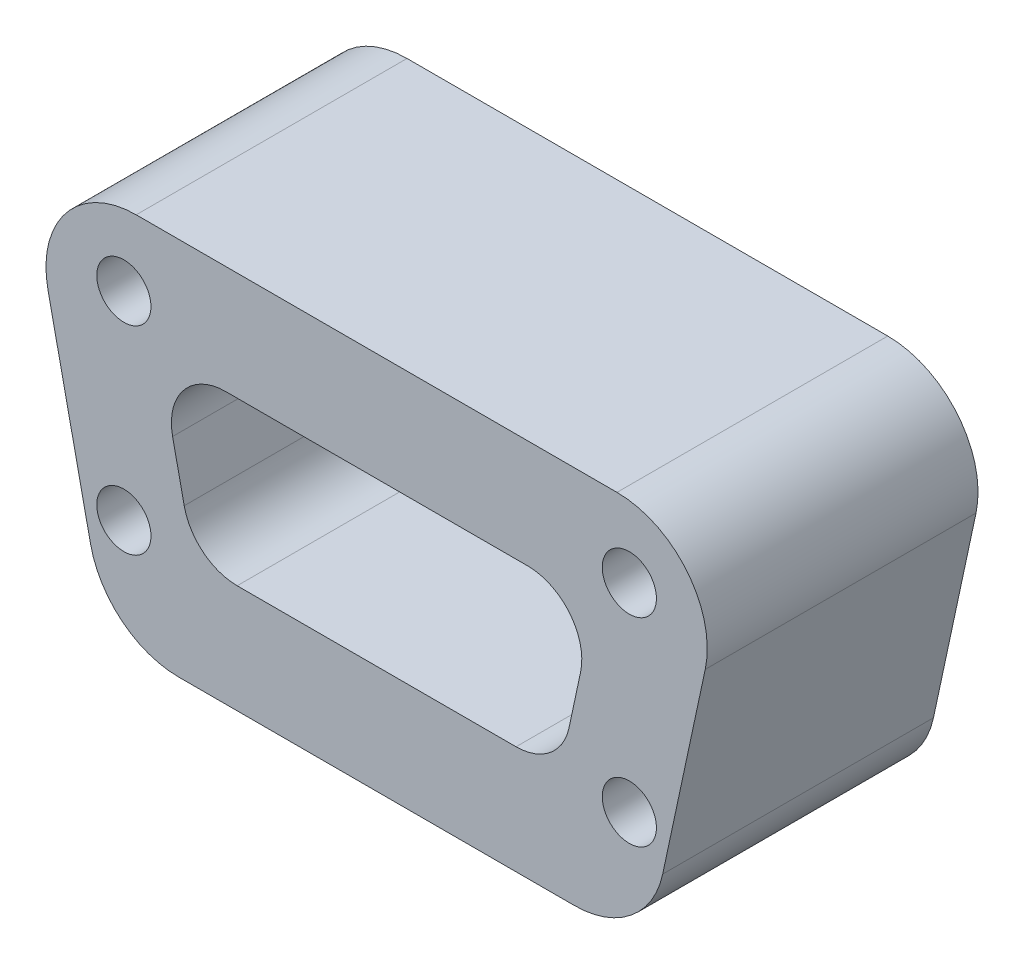
ISO-10303-21;
HEADER;
FILE_DESCRIPTION(('STEP AP214'),'2;1');
FILE_NAME('part.step','',(''),(''),'','','');
FILE_SCHEMA(('AUTOMOTIVE_DESIGN { 1 0 10303 214 1 1 1 1 }'));
ENDSEC;
DATA;
#1=APPLICATION_CONTEXT('core data for automotive mechanical design processes');
#2=APPLICATION_PROTOCOL_DEFINITION('international standard','automotive_design',2000,#1);
#3=PRODUCT_CONTEXT('',#1,'mechanical');
#4=PRODUCT('Part','Part','',(#3));
#5=PRODUCT_RELATED_PRODUCT_CATEGORY('part','',(#4));
#6=PRODUCT_DEFINITION_FORMATION('','',#4);
#7=PRODUCT_DEFINITION_CONTEXT('part definition',#1,'design');
#8=PRODUCT_DEFINITION('design','',#6,#7);
#9=PRODUCT_DEFINITION_SHAPE('','',#8);
#10=(LENGTH_UNIT() NAMED_UNIT(*) SI_UNIT(.MILLI.,.METRE.));
#11=(NAMED_UNIT(*) PLANE_ANGLE_UNIT() SI_UNIT($,.RADIAN.));
#12=(NAMED_UNIT(*) SI_UNIT($,.STERADIAN.) SOLID_ANGLE_UNIT());
#13=UNCERTAINTY_MEASURE_WITH_UNIT(LENGTH_MEASURE(1.E-05),#10,'distance_accuracy_value','');
#14=(GEOMETRIC_REPRESENTATION_CONTEXT(3) GLOBAL_UNCERTAINTY_ASSIGNED_CONTEXT((#13)) GLOBAL_UNIT_ASSIGNED_CONTEXT((#10,
#11,#12)) REPRESENTATION_CONTEXT('',''));
#15=CARTESIAN_POINT('',(0.,0.,0.));
#16=DIRECTION('',(0.,0.,1.));
#17=DIRECTION('',(1.,0.,0.));
#18=AXIS2_PLACEMENT_3D('',#15,#16,#17);
#19=CARTESIAN_POINT('',(0.,0.,15.));
#20=DIRECTION('',(0.,0.,-1.));
#21=DIRECTION('',(-1.,0.,0.));
#22=AXIS2_PLACEMENT_3D('',#19,#20,#21);
#23=PLANE('',#22);
#24=CARTESIAN_POINT('',(14.,5.5,15.));
#25=DIRECTION('',(0.,0.,1.));
#26=DIRECTION('',(1.,0.,0.));
#27=AXIS2_PLACEMENT_3D('',#24,#25,#26);
#28=CIRCLE('',#27,1.5);
#29=CARTESIAN_POINT('',(15.5,5.5,15.));
#30=VERTEX_POINT('',#29);
#31=EDGE_CURVE('E275',#30,#30,#28,.T.);
#32=ORIENTED_EDGE('',*,*,#31,.F.);
#33=EDGE_LOOP('',(#32));
#34=FACE_BOUND('',#33,.T.);
#35=CARTESIAN_POINT('',(-14.,5.5,15.));
#36=DIRECTION('',(0.,0.,1.));
#37=DIRECTION('',(1.,0.,0.));
#38=AXIS2_PLACEMENT_3D('',#35,#36,#37);
#39=CIRCLE('',#38,1.5);
#40=CARTESIAN_POINT('',(-12.5,5.5,15.));
#41=VERTEX_POINT('',#40);
#42=EDGE_CURVE('E281',#41,#41,#39,.T.);
#43=ORIENTED_EDGE('',*,*,#42,.F.);
#44=EDGE_LOOP('',(#43));
#45=FACE_BOUND('',#44,.T.);
#46=CARTESIAN_POINT('',(-14.,-5.5,15.));
#47=DIRECTION('',(0.,0.,1.));
#48=DIRECTION('',(1.,0.,0.));
#49=AXIS2_PLACEMENT_3D('',#46,#47,#48);
#50=CIRCLE('',#49,1.5);
#51=CARTESIAN_POINT('',(-12.5,-5.5,15.));
#52=VERTEX_POINT('',#51);
#53=EDGE_CURVE('E287',#52,#52,#50,.T.);
#54=ORIENTED_EDGE('',*,*,#53,.F.);
#55=EDGE_LOOP('',(#54));
#56=FACE_BOUND('',#55,.T.);
#57=CARTESIAN_POINT('',(14.,-5.5,15.));
#58=DIRECTION('',(0.,0.,1.));
#59=DIRECTION('',(1.,0.,0.));
#60=AXIS2_PLACEMENT_3D('',#57,#58,#59);
#61=CIRCLE('',#60,1.5);
#62=CARTESIAN_POINT('',(15.5,-5.5,15.));
#63=VERTEX_POINT('',#62);
#64=EDGE_CURVE('E293',#63,#63,#61,.T.);
#65=ORIENTED_EDGE('',*,*,#64,.F.);
#66=EDGE_LOOP('',(#65));
#67=FACE_BOUND('',#66,.T.);
#68=DIRECTION('',(0.209529088730873,-0.97780241407741,0.));
#69=VECTOR('',#68,1.);
#70=CARTESIAN_POINT('',(-19.5,9.5,15.));
#71=LINE('',#70,#69);
#72=CARTESIAN_POINT('',(-18.2040759763598,3.45235455634563,15.));
#73=VERTEX_POINT('',#72);
#74=CARTESIAN_POINT('',(-15.8469331192169,-7.54764544365437,15.));
#75=VERTEX_POINT('',#74);
#76=EDGE_CURVE('E301',#73,#75,#71,.T.);
#77=ORIENTED_EDGE('',*,*,#76,.T.);
#78=CARTESIAN_POINT('',(-10.9579210488299,-6.5,15.));
#79=DIRECTION('',(0.,0.,-1.));
#80=DIRECTION('',(-1.,0.,0.));
#81=AXIS2_PLACEMENT_3D('',#78,#79,#80);
#82=CIRCLE('',#81,5.);
#83=CARTESIAN_POINT('',(-10.9579210488299,-11.5,15.));
#84=VERTEX_POINT('',#83);
#85=EDGE_CURVE('E198',#75,#84,#82,.F.);
#86=ORIENTED_EDGE('',*,*,#85,.T.);
#87=DIRECTION('',(1.,0.,0.));
#88=VECTOR('',#87,1.);
#89=CARTESIAN_POINT('',(15.,-11.5,15.));
#90=LINE('',#89,#88);
#91=CARTESIAN_POINT('',(10.9579210488299,-11.5,15.));
#92=VERTEX_POINT('',#91);
#93=EDGE_CURVE('E167',#84,#92,#90,.T.);
#94=ORIENTED_EDGE('',*,*,#93,.T.);
#95=CARTESIAN_POINT('',(10.9579210488299,-6.5,15.));
#96=DIRECTION('',(0.,0.,-1.));
#97=DIRECTION('',(-1.,0.,0.));
#98=AXIS2_PLACEMENT_3D('',#95,#96,#97);
#99=CIRCLE('',#98,5.);
#100=CARTESIAN_POINT('',(15.8469331192169,-7.54764544365437,15.));
#101=VERTEX_POINT('',#100);
#102=EDGE_CURVE('E196',#92,#101,#99,.F.);
#103=ORIENTED_EDGE('',*,*,#102,.T.);
#104=DIRECTION('',(0.209529088730873,0.97780241407741,0.));
#105=VECTOR('',#104,1.);
#106=CARTESIAN_POINT('',(19.5,9.5,15.));
#107=LINE('',#106,#105);
#108=CARTESIAN_POINT('',(18.2040759763598,3.45235455634563,15.));
#109=VERTEX_POINT('',#108);
#110=EDGE_CURVE('E174',#101,#109,#107,.T.);
#111=ORIENTED_EDGE('',*,*,#110,.T.);
#112=CARTESIAN_POINT('',(13.3150639059727,4.5,15.));
#113=DIRECTION('',(0.,0.,-1.));
#114=DIRECTION('',(-1.,0.,0.));
#115=AXIS2_PLACEMENT_3D('',#112,#113,#114);
#116=CIRCLE('',#115,5.);
#117=CARTESIAN_POINT('',(13.3150639059727,9.5,15.));
#118=VERTEX_POINT('',#117);
#119=EDGE_CURVE('E192',#109,#118,#116,.F.);
#120=ORIENTED_EDGE('',*,*,#119,.T.);
#121=DIRECTION('',(-1.,0.,0.));
#122=VECTOR('',#121,1.);
#123=CARTESIAN_POINT('',(19.5,9.5,15.));
#124=LINE('',#123,#122);
#125=CARTESIAN_POINT('',(-13.3150639059727,9.5,15.));
#126=VERTEX_POINT('',#125);
#127=EDGE_CURVE('E178',#118,#126,#124,.T.);
#128=ORIENTED_EDGE('',*,*,#127,.T.);
#129=CARTESIAN_POINT('',(-13.3150639059727,4.5,15.));
#130=DIRECTION('',(0.,0.,-1.));
#131=DIRECTION('',(-1.,0.,0.));
#132=AXIS2_PLACEMENT_3D('',#129,#130,#131);
#133=CIRCLE('',#132,5.);
#134=EDGE_CURVE('E194',#126,#73,#133,.F.);
#135=ORIENTED_EDGE('',*,*,#134,.T.);
#136=EDGE_LOOP('',(#77,#86,#94,#103,#111,#120,#128,#135));
#137=FACE_BOUND('',#136,.T.);
#138=DIRECTION('',(-1.,0.,0.));
#139=VECTOR('',#138,1.);
#140=CARTESIAN_POINT('',(12.0780766871673,3.5,15.));
#141=LINE('',#140,#139);
#142=CARTESIAN_POINT('',(8.36711503075091,3.5,15.));
#143=VERTEX_POINT('',#142);
#144=CARTESIAN_POINT('',(-8.36711503075092,3.5,15.));
#145=VERTEX_POINT('',#144);
#146=EDGE_CURVE('E257',#143,#145,#141,.T.);
#147=ORIENTED_EDGE('',*,*,#146,.F.);
#148=CARTESIAN_POINT('',(8.36711503075091,0.5,15.));
#149=DIRECTION('',(0.,0.,-1.));
#150=DIRECTION('',(-1.,0.,0.));
#151=AXIS2_PLACEMENT_3D('',#148,#149,#150);
#152=CIRCLE('',#151,3.);
#153=CARTESIAN_POINT('',(11.3005222729831,-0.12858726619262,15.));
#154=VERTEX_POINT('',#153);
#155=EDGE_CURVE('E239',#143,#154,#152,.T.);
#156=ORIENTED_EDGE('',*,*,#155,.T.);
#157=DIRECTION('',(0.209529088730873,0.97780241407741,0.));
#158=VECTOR('',#157,1.);
#159=CARTESIAN_POINT('',(12.0780766871673,3.5,15.));
#160=LINE('',#159,#158);
#161=CARTESIAN_POINT('',(10.657665130126,-3.12858726619262,15.));
#162=VERTEX_POINT('',#161);
#163=EDGE_CURVE('E269',#162,#154,#160,.T.);
#164=ORIENTED_EDGE('',*,*,#163,.F.);
#165=CARTESIAN_POINT('',(7.72425788789377,-2.5,15.));
#166=DIRECTION('',(0.,0.,-1.));
#167=DIRECTION('',(-1.,0.,0.));
#168=AXIS2_PLACEMENT_3D('',#165,#166,#167);
#169=CIRCLE('',#168,3.);
#170=CARTESIAN_POINT('',(7.72425788789377,-5.5,15.));
#171=VERTEX_POINT('',#170);
#172=EDGE_CURVE('E235',#162,#171,#169,.T.);
#173=ORIENTED_EDGE('',*,*,#172,.T.);
#174=DIRECTION('',(1.,0.,0.));
#175=VECTOR('',#174,1.);
#176=CARTESIAN_POINT('',(10.1495052585958,-5.5,15.));
#177=LINE('',#176,#175);
#178=CARTESIAN_POINT('',(-7.72425788789378,-5.5,15.));
#179=VERTEX_POINT('',#178);
#180=EDGE_CURVE('E262',#179,#171,#177,.T.);
#181=ORIENTED_EDGE('',*,*,#180,.F.);
#182=CARTESIAN_POINT('',(-7.72425788789378,-2.5,15.));
#183=DIRECTION('',(0.,0.,-1.));
#184=DIRECTION('',(-1.,0.,0.));
#185=AXIS2_PLACEMENT_3D('',#182,#183,#184);
#186=CIRCLE('',#185,3.);
#187=CARTESIAN_POINT('',(-10.657665130126,-3.12858726619262,15.));
#188=VERTEX_POINT('',#187);
#189=EDGE_CURVE('E231',#179,#188,#186,.T.);
#190=ORIENTED_EDGE('',*,*,#189,.T.);
#191=DIRECTION('',(0.209529088730873,-0.97780241407741,0.));
#192=VECTOR('',#191,1.);
#193=CARTESIAN_POINT('',(-12.0780766871673,3.5,15.));
#194=LINE('',#193,#192);
#195=CARTESIAN_POINT('',(-11.3005222729831,-0.128587266192618,15.));
#196=VERTEX_POINT('',#195);
#197=EDGE_CURVE('E259',#196,#188,#194,.T.);
#198=ORIENTED_EDGE('',*,*,#197,.F.);
#199=CARTESIAN_POINT('',(-8.36711503075092,0.5,15.));
#200=DIRECTION('',(0.,0.,-1.));
#201=DIRECTION('',(-1.,0.,0.));
#202=AXIS2_PLACEMENT_3D('',#199,#200,#201);
#203=CIRCLE('',#202,3.);
#204=EDGE_CURVE('E11',#196,#145,#203,.T.);
#205=ORIENTED_EDGE('',*,*,#204,.T.);
#206=EDGE_LOOP('',(#147,#156,#164,#173,#181,#190,#198,#205));
#207=FACE_BOUND('',#206,.T.);
#208=ADVANCED_FACE('F34',(#34,#45,#56,#67,#137,#207),#23,.F.);
#209=CARTESIAN_POINT('',(0.,0.,0.));
#210=DIRECTION('',(0.,0.,-1.));
#211=DIRECTION('',(-1.,0.,0.));
#212=AXIS2_PLACEMENT_3D('',#209,#210,#211);
#213=PLANE('',#212);
#214=CARTESIAN_POINT('',(-14.,5.5,0.));
#215=DIRECTION('',(0.,0.,1.));
#216=DIRECTION('',(1.,0.,0.));
#217=AXIS2_PLACEMENT_3D('',#214,#215,#216);
#218=CIRCLE('',#217,1.5);
#219=CARTESIAN_POINT('',(-12.5,5.5,0.));
#220=VERTEX_POINT('',#219);
#221=EDGE_CURVE('E278',#220,#220,#218,.T.);
#222=ORIENTED_EDGE('',*,*,#221,.T.);
#223=EDGE_LOOP('',(#222));
#224=FACE_BOUND('',#223,.T.);
#225=CARTESIAN_POINT('',(14.,-5.5,0.));
#226=DIRECTION('',(0.,0.,1.));
#227=DIRECTION('',(1.,0.,0.));
#228=AXIS2_PLACEMENT_3D('',#225,#226,#227);
#229=CIRCLE('',#228,1.5);
#230=CARTESIAN_POINT('',(15.5,-5.5,0.));
#231=VERTEX_POINT('',#230);
#232=EDGE_CURVE('E290',#231,#231,#229,.T.);
#233=ORIENTED_EDGE('',*,*,#232,.T.);
#234=EDGE_LOOP('',(#233));
#235=FACE_BOUND('',#234,.T.);
#236=DIRECTION('',(1.,0.,0.));
#237=VECTOR('',#236,1.);
#238=CARTESIAN_POINT('',(15.,-11.5,0.));
#239=LINE('',#238,#237);
#240=CARTESIAN_POINT('',(-10.9579210488299,-11.5,0.));
#241=VERTEX_POINT('',#240);
#242=CARTESIAN_POINT('',(10.9579210488299,-11.5,0.));
#243=VERTEX_POINT('',#242);
#244=EDGE_CURVE('E164',#241,#243,#239,.T.);
#245=ORIENTED_EDGE('',*,*,#244,.F.);
#246=CARTESIAN_POINT('',(-10.9579210488299,-6.5,0.));
#247=DIRECTION('',(0.,0.,-1.));
#248=DIRECTION('',(-1.,0.,0.));
#249=AXIS2_PLACEMENT_3D('',#246,#247,#248);
#250=CIRCLE('',#249,5.);
#251=CARTESIAN_POINT('',(-15.8469331192169,-7.54764544365437,0.));
#252=VERTEX_POINT('',#251);
#253=EDGE_CURVE('E147',#241,#252,#250,.T.);
#254=ORIENTED_EDGE('',*,*,#253,.T.);
#255=DIRECTION('',(0.209529088730873,-0.97780241407741,0.));
#256=VECTOR('',#255,1.);
#257=CARTESIAN_POINT('',(-19.5,9.5,0.));
#258=LINE('',#257,#256);
#259=CARTESIAN_POINT('',(-18.2040759763598,3.45235455634563,0.));
#260=VERTEX_POINT('',#259);
#261=EDGE_CURVE('E175',#260,#252,#258,.T.);
#262=ORIENTED_EDGE('',*,*,#261,.F.);
#263=CARTESIAN_POINT('',(-13.3150639059727,4.5,0.));
#264=DIRECTION('',(0.,0.,-1.));
#265=DIRECTION('',(-1.,0.,0.));
#266=AXIS2_PLACEMENT_3D('',#263,#264,#265);
#267=CIRCLE('',#266,5.);
#268=CARTESIAN_POINT('',(-13.3150639059727,9.5,0.));
#269=VERTEX_POINT('',#268);
#270=EDGE_CURVE('E186',#260,#269,#267,.T.);
#271=ORIENTED_EDGE('',*,*,#270,.T.);
#272=DIRECTION('',(-1.,0.,0.));
#273=VECTOR('',#272,1.);
#274=CARTESIAN_POINT('',(19.5,9.5,0.));
#275=LINE('',#274,#273);
#276=CARTESIAN_POINT('',(13.3150639059727,9.5,0.));
#277=VERTEX_POINT('',#276);
#278=EDGE_CURVE('E180',#277,#269,#275,.T.);
#279=ORIENTED_EDGE('',*,*,#278,.F.);
#280=CARTESIAN_POINT('',(13.3150639059727,4.5,0.));
#281=DIRECTION('',(0.,0.,-1.));
#282=DIRECTION('',(-1.,0.,0.));
#283=AXIS2_PLACEMENT_3D('',#280,#281,#282);
#284=CIRCLE('',#283,5.);
#285=CARTESIAN_POINT('',(18.2040759763598,3.45235455634563,0.));
#286=VERTEX_POINT('',#285);
#287=EDGE_CURVE('E168',#277,#286,#284,.T.);
#288=ORIENTED_EDGE('',*,*,#287,.T.);
#289=DIRECTION('',(0.209529088730873,0.97780241407741,0.));
#290=VECTOR('',#289,1.);
#291=CARTESIAN_POINT('',(19.5,9.5,0.));
#292=LINE('',#291,#290);
#293=CARTESIAN_POINT('',(15.8469331192169,-7.54764544365437,0.));
#294=VERTEX_POINT('',#293);
#295=EDGE_CURVE('E296',#294,#286,#292,.T.);
#296=ORIENTED_EDGE('',*,*,#295,.F.);
#297=CARTESIAN_POINT('',(10.9579210488299,-6.5,0.));
#298=DIRECTION('',(0.,0.,-1.));
#299=DIRECTION('',(-1.,0.,0.));
#300=AXIS2_PLACEMENT_3D('',#297,#298,#299);
#301=CIRCLE('',#300,5.);
#302=EDGE_CURVE('E158',#294,#243,#301,.T.);
#303=ORIENTED_EDGE('',*,*,#302,.T.);
#304=EDGE_LOOP('',(#245,#254,#262,#271,#279,#288,#296,#303));
#305=FACE_BOUND('',#304,.T.);
#306=CARTESIAN_POINT('',(-14.,-5.5,0.));
#307=DIRECTION('',(0.,0.,1.));
#308=DIRECTION('',(1.,0.,0.));
#309=AXIS2_PLACEMENT_3D('',#306,#307,#308);
#310=CIRCLE('',#309,1.5);
#311=CARTESIAN_POINT('',(-12.5,-5.5,0.));
#312=VERTEX_POINT('',#311);
#313=EDGE_CURVE('E284',#312,#312,#310,.T.);
#314=ORIENTED_EDGE('',*,*,#313,.T.);
#315=EDGE_LOOP('',(#314));
#316=FACE_BOUND('',#315,.T.);
#317=CARTESIAN_POINT('',(14.,5.5,0.));
#318=DIRECTION('',(0.,0.,1.));
#319=DIRECTION('',(1.,0.,0.));
#320=AXIS2_PLACEMENT_3D('',#317,#318,#319);
#321=CIRCLE('',#320,1.5);
#322=CARTESIAN_POINT('',(15.5,5.5,0.));
#323=VERTEX_POINT('',#322);
#324=EDGE_CURVE('E272',#323,#323,#321,.T.);
#325=ORIENTED_EDGE('',*,*,#324,.T.);
#326=EDGE_LOOP('',(#325));
#327=FACE_BOUND('',#326,.T.);
#328=DIRECTION('',(1.,0.,0.));
#329=VECTOR('',#328,1.);
#330=CARTESIAN_POINT('',(10.1495052585958,-5.5,0.));
#331=LINE('',#330,#329);
#332=CARTESIAN_POINT('',(-7.72425788789378,-5.5,0.));
#333=VERTEX_POINT('',#332);
#334=CARTESIAN_POINT('',(7.72425788789377,-5.5,0.));
#335=VERTEX_POINT('',#334);
#336=EDGE_CURVE('E254',#333,#335,#331,.T.);
#337=ORIENTED_EDGE('',*,*,#336,.T.);
#338=CARTESIAN_POINT('',(7.72425788789377,-2.5,0.));
#339=DIRECTION('',(0.,0.,-1.));
#340=DIRECTION('',(-1.,0.,0.));
#341=AXIS2_PLACEMENT_3D('',#338,#339,#340);
#342=CIRCLE('',#341,3.);
#343=CARTESIAN_POINT('',(10.657665130126,-3.12858726619262,0.));
#344=VERTEX_POINT('',#343);
#345=EDGE_CURVE('E233',#335,#344,#342,.F.);
#346=ORIENTED_EDGE('',*,*,#345,.T.);
#347=DIRECTION('',(0.209529088730873,0.97780241407741,0.));
#348=VECTOR('',#347,1.);
#349=CARTESIAN_POINT('',(12.0780766871673,3.5,0.));
#350=LINE('',#349,#348);
#351=CARTESIAN_POINT('',(11.3005222729831,-0.12858726619262,0.));
#352=VERTEX_POINT('',#351);
#353=EDGE_CURVE('E260',#344,#352,#350,.T.);
#354=ORIENTED_EDGE('',*,*,#353,.T.);
#355=CARTESIAN_POINT('',(8.36711503075091,0.5,0.));
#356=DIRECTION('',(0.,0.,-1.));
#357=DIRECTION('',(-1.,0.,0.));
#358=AXIS2_PLACEMENT_3D('',#355,#356,#357);
#359=CIRCLE('',#358,3.);
#360=CARTESIAN_POINT('',(8.36711503075091,3.5,0.));
#361=VERTEX_POINT('',#360);
#362=EDGE_CURVE('E237',#352,#361,#359,.F.);
#363=ORIENTED_EDGE('',*,*,#362,.T.);
#364=DIRECTION('',(-1.,0.,0.));
#365=VECTOR('',#364,1.);
#366=CARTESIAN_POINT('',(12.0780766871673,3.5,0.));
#367=LINE('',#366,#365);
#368=CARTESIAN_POINT('',(-8.36711503075092,3.5,0.));
#369=VERTEX_POINT('',#368);
#370=EDGE_CURVE('E246',#361,#369,#367,.T.);
#371=ORIENTED_EDGE('',*,*,#370,.T.);
#372=CARTESIAN_POINT('',(-8.36711503075092,0.5,0.));
#373=DIRECTION('',(0.,0.,-1.));
#374=DIRECTION('',(-1.,0.,0.));
#375=AXIS2_PLACEMENT_3D('',#372,#373,#374);
#376=CIRCLE('',#375,3.);
#377=CARTESIAN_POINT('',(-11.3005222729831,-0.128587266192618,0.));
#378=VERTEX_POINT('',#377);
#379=EDGE_CURVE('E42',#369,#378,#376,.F.);
#380=ORIENTED_EDGE('',*,*,#379,.T.);
#381=DIRECTION('',(0.209529088730873,-0.97780241407741,0.));
#382=VECTOR('',#381,1.);
#383=CARTESIAN_POINT('',(-12.0780766871673,3.5,0.));
#384=LINE('',#383,#382);
#385=CARTESIAN_POINT('',(-10.657665130126,-3.12858726619262,0.));
#386=VERTEX_POINT('',#385);
#387=EDGE_CURVE('E245',#378,#386,#384,.T.);
#388=ORIENTED_EDGE('',*,*,#387,.T.);
#389=CARTESIAN_POINT('',(-7.72425788789378,-2.5,0.));
#390=DIRECTION('',(0.,0.,-1.));
#391=DIRECTION('',(-1.,0.,0.));
#392=AXIS2_PLACEMENT_3D('',#389,#390,#391);
#393=CIRCLE('',#392,3.);
#394=EDGE_CURVE('E229',#386,#333,#393,.F.);
#395=ORIENTED_EDGE('',*,*,#394,.T.);
#396=EDGE_LOOP('',(#337,#346,#354,#363,#371,#380,#388,#395));
#397=FACE_BOUND('',#396,.T.);
#398=ADVANCED_FACE('F171',(#224,#235,#305,#316,#327,#397),#213,.T.);
#399=CARTESIAN_POINT('',(19.5,9.5,15.));
#400=DIRECTION('',(-0.97780241407741,0.209529088730873,0.));
#401=DIRECTION('',(-0.209529088730873,-0.97780241407741,0.));
#402=AXIS2_PLACEMENT_3D('',#399,#400,#401);
#403=PLANE('',#402);
#404=ORIENTED_EDGE('',*,*,#110,.F.);
#405=DIRECTION('',(0.,0.,-1.));
#406=VECTOR('',#405,1.);
#407=CARTESIAN_POINT('',(15.8469331192169,-7.54764544365437,15.));
#408=LINE('',#407,#406);
#409=EDGE_CURVE('E202',#101,#294,#408,.T.);
#410=ORIENTED_EDGE('',*,*,#409,.T.);
#411=ORIENTED_EDGE('',*,*,#295,.T.);
#412=DIRECTION('',(0.,0.,-1.));
#413=VECTOR('',#412,1.);
#414=CARTESIAN_POINT('',(18.2040759763598,3.45235455634563,15.));
#415=LINE('',#414,#413);
#416=EDGE_CURVE('E200',#286,#109,#415,.F.);
#417=ORIENTED_EDGE('',*,*,#416,.T.);
#418=EDGE_LOOP('',(#404,#410,#411,#417));
#419=FACE_BOUND('',#418,.T.);
#420=ADVANCED_FACE('F329',(#419),#403,.F.);
#421=CARTESIAN_POINT('',(19.5,9.5,15.));
#422=DIRECTION('',(0.,-1.,0.));
#423=DIRECTION('',(0.,0.,-1.));
#424=AXIS2_PLACEMENT_3D('',#421,#422,#423);
#425=PLANE('',#424);
#426=ORIENTED_EDGE('',*,*,#278,.T.);
#427=DIRECTION('',(0.,0.,-1.));
#428=VECTOR('',#427,1.);
#429=CARTESIAN_POINT('',(-13.3150639059727,9.5,15.));
#430=LINE('',#429,#428);
#431=EDGE_CURVE('E208',#269,#126,#430,.F.);
#432=ORIENTED_EDGE('',*,*,#431,.T.);
#433=ORIENTED_EDGE('',*,*,#127,.F.);
#434=DIRECTION('',(0.,0.,-1.));
#435=VECTOR('',#434,1.);
#436=CARTESIAN_POINT('',(13.3150639059727,9.5,15.));
#437=LINE('',#436,#435);
#438=EDGE_CURVE('E205',#118,#277,#437,.T.);
#439=ORIENTED_EDGE('',*,*,#438,.T.);
#440=EDGE_LOOP('',(#426,#432,#433,#439));
#441=FACE_BOUND('',#440,.T.);
#442=ADVANCED_FACE('F310',(#441),#425,.F.);
#443=CARTESIAN_POINT('',(-19.5,9.5,15.));
#444=DIRECTION('',(0.97780241407741,0.209529088730873,0.));
#445=DIRECTION('',(-0.209529088730873,0.97780241407741,0.));
#446=AXIS2_PLACEMENT_3D('',#443,#444,#445);
#447=PLANE('',#446);
#448=ORIENTED_EDGE('',*,*,#261,.T.);
#449=DIRECTION('',(0.,0.,-1.));
#450=VECTOR('',#449,1.);
#451=CARTESIAN_POINT('',(-15.8469331192169,-7.54764544365437,15.));
#452=LINE('',#451,#450);
#453=EDGE_CURVE('E152',#252,#75,#452,.F.);
#454=ORIENTED_EDGE('',*,*,#453,.T.);
#455=ORIENTED_EDGE('',*,*,#76,.F.);
#456=DIRECTION('',(0.,0.,-1.));
#457=VECTOR('',#456,1.);
#458=CARTESIAN_POINT('',(-18.2040759763598,3.45235455634563,15.));
#459=LINE('',#458,#457);
#460=EDGE_CURVE('E157',#73,#260,#459,.T.);
#461=ORIENTED_EDGE('',*,*,#460,.T.);
#462=EDGE_LOOP('',(#448,#454,#455,#461));
#463=FACE_BOUND('',#462,.T.);
#464=ADVANCED_FACE('F320',(#463),#447,.F.);
#465=CARTESIAN_POINT('',(15.,-11.5,15.));
#466=DIRECTION('',(0.,1.,0.));
#467=DIRECTION('',(0.,0.,1.));
#468=AXIS2_PLACEMENT_3D('',#465,#466,#467);
#469=PLANE('',#468);
#470=ORIENTED_EDGE('',*,*,#93,.F.);
#471=DIRECTION('',(0.,0.,-1.));
#472=VECTOR('',#471,1.);
#473=CARTESIAN_POINT('',(-10.9579210488299,-11.5,15.));
#474=LINE('',#473,#472);
#475=EDGE_CURVE('E151',#84,#241,#474,.T.);
#476=ORIENTED_EDGE('',*,*,#475,.T.);
#477=ORIENTED_EDGE('',*,*,#244,.T.);
#478=DIRECTION('',(0.,0.,-1.));
#479=VECTOR('',#478,1.);
#480=CARTESIAN_POINT('',(10.9579210488299,-11.5,15.));
#481=LINE('',#480,#479);
#482=EDGE_CURVE('E169',#243,#92,#481,.F.);
#483=ORIENTED_EDGE('',*,*,#482,.T.);
#484=EDGE_LOOP('',(#470,#476,#477,#483));
#485=FACE_BOUND('',#484,.T.);
#486=ADVANCED_FACE('F163',(#485),#469,.F.);
#487=CARTESIAN_POINT('',(14.,-5.5,15.));
#488=DIRECTION('',(0.,0.,-1.));
#489=DIRECTION('',(-1.,0.,0.));
#490=AXIS2_PLACEMENT_3D('',#487,#488,#489);
#491=CYLINDRICAL_SURFACE('',#490,1.5);
#492=ORIENTED_EDGE('',*,*,#64,.T.);
#493=EDGE_LOOP('',(#492));
#494=FACE_BOUND('',#493,.T.);
#495=ORIENTED_EDGE('',*,*,#232,.F.);
#496=EDGE_LOOP('',(#495));
#497=FACE_BOUND('',#496,.T.);
#498=ADVANCED_FACE('F327',(#494,#497),#491,.F.);
#499=CARTESIAN_POINT('',(-14.,-5.5,15.));
#500=DIRECTION('',(0.,0.,-1.));
#501=DIRECTION('',(-1.,0.,0.));
#502=AXIS2_PLACEMENT_3D('',#499,#500,#501);
#503=CYLINDRICAL_SURFACE('',#502,1.5);
#504=ORIENTED_EDGE('',*,*,#53,.T.);
#505=EDGE_LOOP('',(#504));
#506=FACE_BOUND('',#505,.T.);
#507=ORIENTED_EDGE('',*,*,#313,.F.);
#508=EDGE_LOOP('',(#507));
#509=FACE_BOUND('',#508,.T.);
#510=ADVANCED_FACE('F344',(#506,#509),#503,.F.);
#511=CARTESIAN_POINT('',(-14.,5.5,15.));
#512=DIRECTION('',(0.,0.,-1.));
#513=DIRECTION('',(-1.,0.,0.));
#514=AXIS2_PLACEMENT_3D('',#511,#512,#513);
#515=CYLINDRICAL_SURFACE('',#514,1.5);
#516=ORIENTED_EDGE('',*,*,#42,.T.);
#517=EDGE_LOOP('',(#516));
#518=FACE_BOUND('',#517,.T.);
#519=ORIENTED_EDGE('',*,*,#221,.F.);
#520=EDGE_LOOP('',(#519));
#521=FACE_BOUND('',#520,.T.);
#522=ADVANCED_FACE('F348',(#518,#521),#515,.F.);
#523=CARTESIAN_POINT('',(14.,5.5,15.));
#524=DIRECTION('',(0.,0.,-1.));
#525=DIRECTION('',(-1.,0.,0.));
#526=AXIS2_PLACEMENT_3D('',#523,#524,#525);
#527=CYLINDRICAL_SURFACE('',#526,1.5);
#528=ORIENTED_EDGE('',*,*,#31,.T.);
#529=EDGE_LOOP('',(#528));
#530=FACE_BOUND('',#529,.T.);
#531=ORIENTED_EDGE('',*,*,#324,.F.);
#532=EDGE_LOOP('',(#531));
#533=FACE_BOUND('',#532,.T.);
#534=ADVANCED_FACE('F352',(#530,#533),#527,.F.);
#535=CARTESIAN_POINT('',(12.0780766871673,3.5,15.));
#536=DIRECTION('',(0.,-1.,0.));
#537=DIRECTION('',(0.,0.,-1.));
#538=AXIS2_PLACEMENT_3D('',#535,#536,#537);
#539=PLANE('',#538);
#540=ORIENTED_EDGE('',*,*,#370,.F.);
#541=DIRECTION('',(0.,0.,-1.));
#542=VECTOR('',#541,1.);
#543=CARTESIAN_POINT('',(8.36711503075091,3.5,15.));
#544=LINE('',#543,#542);
#545=EDGE_CURVE('E54',#361,#143,#544,.F.);
#546=ORIENTED_EDGE('',*,*,#545,.T.);
#547=ORIENTED_EDGE('',*,*,#146,.T.);
#548=DIRECTION('',(0.,0.,-1.));
#549=VECTOR('',#548,1.);
#550=CARTESIAN_POINT('',(-8.36711503075092,3.5,0.));
#551=LINE('',#550,#549);
#552=EDGE_CURVE('E225',#145,#369,#551,.T.);
#553=ORIENTED_EDGE('',*,*,#552,.T.);
#554=EDGE_LOOP('',(#540,#546,#547,#553));
#555=FACE_BOUND('',#554,.T.);
#556=ADVANCED_FACE('F256',(#555),#539,.T.);
#557=CARTESIAN_POINT('',(-12.0780766871673,3.5,15.));
#558=DIRECTION('',(0.97780241407741,0.209529088730873,0.));
#559=DIRECTION('',(-0.209529088730873,0.97780241407741,0.));
#560=AXIS2_PLACEMENT_3D('',#557,#558,#559);
#561=PLANE('',#560);
#562=ORIENTED_EDGE('',*,*,#197,.T.);
#563=DIRECTION('',(0.,0.,-1.));
#564=VECTOR('',#563,1.);
#565=CARTESIAN_POINT('',(-10.657665130126,-3.12858726619262,0.));
#566=LINE('',#565,#564);
#567=EDGE_CURVE('E212',#188,#386,#566,.T.);
#568=ORIENTED_EDGE('',*,*,#567,.T.);
#569=ORIENTED_EDGE('',*,*,#387,.F.);
#570=DIRECTION('',(0.,0.,-1.));
#571=VECTOR('',#570,1.);
#572=CARTESIAN_POINT('',(-11.3005222729831,-0.128587266192619,15.));
#573=LINE('',#572,#571);
#574=EDGE_CURVE('E210',#378,#196,#573,.F.);
#575=ORIENTED_EDGE('',*,*,#574,.T.);
#576=EDGE_LOOP('',(#562,#568,#569,#575));
#577=FACE_BOUND('',#576,.T.);
#578=ADVANCED_FACE('F252',(#577),#561,.T.);
#579=CARTESIAN_POINT('',(10.1495052585958,-5.5,15.));
#580=DIRECTION('',(0.,1.,0.));
#581=DIRECTION('',(0.,0.,1.));
#582=AXIS2_PLACEMENT_3D('',#579,#580,#581);
#583=PLANE('',#582);
#584=ORIENTED_EDGE('',*,*,#336,.F.);
#585=DIRECTION('',(0.,0.,-1.));
#586=VECTOR('',#585,1.);
#587=CARTESIAN_POINT('',(-7.72425788789378,-5.5,15.));
#588=LINE('',#587,#586);
#589=EDGE_CURVE('E218',#333,#179,#588,.F.);
#590=ORIENTED_EDGE('',*,*,#589,.T.);
#591=ORIENTED_EDGE('',*,*,#180,.T.);
#592=DIRECTION('',(0.,0.,-1.));
#593=VECTOR('',#592,1.);
#594=CARTESIAN_POINT('',(7.72425788789377,-5.5,0.));
#595=LINE('',#594,#593);
#596=EDGE_CURVE('E215',#171,#335,#595,.T.);
#597=ORIENTED_EDGE('',*,*,#596,.T.);
#598=EDGE_LOOP('',(#584,#590,#591,#597));
#599=FACE_BOUND('',#598,.T.);
#600=ADVANCED_FACE('F361',(#599),#583,.T.);
#601=CARTESIAN_POINT('',(12.0780766871673,3.5,15.));
#602=DIRECTION('',(-0.97780241407741,0.209529088730873,0.));
#603=DIRECTION('',(-0.209529088730873,-0.97780241407741,0.));
#604=AXIS2_PLACEMENT_3D('',#601,#602,#603);
#605=PLANE('',#604);
#606=ORIENTED_EDGE('',*,*,#353,.F.);
#607=DIRECTION('',(0.,0.,-1.));
#608=VECTOR('',#607,1.);
#609=CARTESIAN_POINT('',(10.657665130126,-3.12858726619262,15.));
#610=LINE('',#609,#608);
#611=EDGE_CURVE('E223',#344,#162,#610,.F.);
#612=ORIENTED_EDGE('',*,*,#611,.T.);
#613=ORIENTED_EDGE('',*,*,#163,.T.);
#614=DIRECTION('',(0.,0.,-1.));
#615=VECTOR('',#614,1.);
#616=CARTESIAN_POINT('',(11.3005222729831,-0.12858726619262,0.));
#617=LINE('',#616,#615);
#618=EDGE_CURVE('E220',#154,#352,#617,.T.);
#619=ORIENTED_EDGE('',*,*,#618,.T.);
#620=EDGE_LOOP('',(#606,#612,#613,#619));
#621=FACE_BOUND('',#620,.T.);
#622=ADVANCED_FACE('F364',(#621),#605,.T.);
#623=CARTESIAN_POINT('',(-10.9579210488299,-6.5,15.));
#624=DIRECTION('',(0.,0.,-1.));
#625=DIRECTION('',(-1.,0.,0.));
#626=AXIS2_PLACEMENT_3D('',#623,#624,#625);
#627=CYLINDRICAL_SURFACE('',#626,5.);
#628=ORIENTED_EDGE('',*,*,#85,.F.);
#629=ORIENTED_EDGE('',*,*,#453,.F.);
#630=ORIENTED_EDGE('',*,*,#253,.F.);
#631=ORIENTED_EDGE('',*,*,#475,.F.);
#632=EDGE_LOOP('',(#628,#629,#630,#631));
#633=FACE_BOUND('',#632,.T.);
#634=ADVANCED_FACE('F150',(#633),#627,.T.);
#635=CARTESIAN_POINT('',(10.9579210488299,-6.5,15.));
#636=DIRECTION('',(0.,0.,-1.));
#637=DIRECTION('',(-1.,0.,0.));
#638=AXIS2_PLACEMENT_3D('',#635,#636,#637);
#639=CYLINDRICAL_SURFACE('',#638,5.);
#640=ORIENTED_EDGE('',*,*,#102,.F.);
#641=ORIENTED_EDGE('',*,*,#482,.F.);
#642=ORIENTED_EDGE('',*,*,#302,.F.);
#643=ORIENTED_EDGE('',*,*,#409,.F.);
#644=EDGE_LOOP('',(#640,#641,#642,#643));
#645=FACE_BOUND('',#644,.T.);
#646=ADVANCED_FACE('F371',(#645),#639,.T.);
#647=CARTESIAN_POINT('',(-13.3150639059727,4.5,15.));
#648=DIRECTION('',(0.,0.,-1.));
#649=DIRECTION('',(-1.,0.,0.));
#650=AXIS2_PLACEMENT_3D('',#647,#648,#649);
#651=CYLINDRICAL_SURFACE('',#650,5.);
#652=ORIENTED_EDGE('',*,*,#134,.F.);
#653=ORIENTED_EDGE('',*,*,#431,.F.);
#654=ORIENTED_EDGE('',*,*,#270,.F.);
#655=ORIENTED_EDGE('',*,*,#460,.F.);
#656=EDGE_LOOP('',(#652,#653,#654,#655));
#657=FACE_BOUND('',#656,.T.);
#658=ADVANCED_FACE('F315',(#657),#651,.T.);
#659=CARTESIAN_POINT('',(13.3150639059727,4.5,15.));
#660=DIRECTION('',(0.,0.,-1.));
#661=DIRECTION('',(-1.,0.,0.));
#662=AXIS2_PLACEMENT_3D('',#659,#660,#661);
#663=CYLINDRICAL_SURFACE('',#662,5.);
#664=ORIENTED_EDGE('',*,*,#119,.F.);
#665=ORIENTED_EDGE('',*,*,#416,.F.);
#666=ORIENTED_EDGE('',*,*,#287,.F.);
#667=ORIENTED_EDGE('',*,*,#438,.F.);
#668=EDGE_LOOP('',(#664,#665,#666,#667));
#669=FACE_BOUND('',#668,.T.);
#670=ADVANCED_FACE('F388',(#669),#663,.T.);
#671=CARTESIAN_POINT('',(-7.72425788789378,-2.5,15.));
#672=DIRECTION('',(0.,0.,1.));
#673=DIRECTION('',(1.,0.,0.));
#674=AXIS2_PLACEMENT_3D('',#671,#672,#673);
#675=CYLINDRICAL_SURFACE('',#674,3.);
#676=ORIENTED_EDGE('',*,*,#189,.F.);
#677=ORIENTED_EDGE('',*,*,#589,.F.);
#678=ORIENTED_EDGE('',*,*,#394,.F.);
#679=ORIENTED_EDGE('',*,*,#567,.F.);
#680=EDGE_LOOP('',(#676,#677,#678,#679));
#681=FACE_BOUND('',#680,.T.);
#682=ADVANCED_FACE('F386',(#681),#675,.F.);
#683=CARTESIAN_POINT('',(7.72425788789377,-2.5,15.));
#684=DIRECTION('',(0.,0.,1.));
#685=DIRECTION('',(1.,0.,0.));
#686=AXIS2_PLACEMENT_3D('',#683,#684,#685);
#687=CYLINDRICAL_SURFACE('',#686,3.);
#688=ORIENTED_EDGE('',*,*,#172,.F.);
#689=ORIENTED_EDGE('',*,*,#611,.F.);
#690=ORIENTED_EDGE('',*,*,#345,.F.);
#691=ORIENTED_EDGE('',*,*,#596,.F.);
#692=EDGE_LOOP('',(#688,#689,#690,#691));
#693=FACE_BOUND('',#692,.T.);
#694=ADVANCED_FACE('F379',(#693),#687,.F.);
#695=CARTESIAN_POINT('',(8.36711503075091,0.5,15.));
#696=DIRECTION('',(0.,0.,1.));
#697=DIRECTION('',(1.,0.,0.));
#698=AXIS2_PLACEMENT_3D('',#695,#696,#697);
#699=CYLINDRICAL_SURFACE('',#698,3.);
#700=ORIENTED_EDGE('',*,*,#155,.F.);
#701=ORIENTED_EDGE('',*,*,#545,.F.);
#702=ORIENTED_EDGE('',*,*,#362,.F.);
#703=ORIENTED_EDGE('',*,*,#618,.F.);
#704=EDGE_LOOP('',(#700,#701,#702,#703));
#705=FACE_BOUND('',#704,.T.);
#706=ADVANCED_FACE('F394',(#705),#699,.F.);
#707=CARTESIAN_POINT('',(-8.36711503075092,0.5,15.));
#708=DIRECTION('',(0.,0.,1.));
#709=DIRECTION('',(1.,0.,0.));
#710=AXIS2_PLACEMENT_3D('',#707,#708,#709);
#711=CYLINDRICAL_SURFACE('',#710,3.);
#712=ORIENTED_EDGE('',*,*,#204,.F.);
#713=ORIENTED_EDGE('',*,*,#574,.F.);
#714=ORIENTED_EDGE('',*,*,#379,.F.);
#715=ORIENTED_EDGE('',*,*,#552,.F.);
#716=EDGE_LOOP('',(#712,#713,#714,#715));
#717=FACE_BOUND('',#716,.T.);
#718=ADVANCED_FACE('F36',(#717),#711,.F.);
#719=CLOSED_SHELL('',(#208,#398,#420,#442,#464,#486,#498,#510,#522,#534,#556,#578,#600,#622,
#634,#646,#658,#670,#682,#694,#706,#718));
#720=MANIFOLD_SOLID_BREP('B2',#719);
#721=ADVANCED_BREP_SHAPE_REPRESENTATION('',(#18,#720),#14);
#722=SHAPE_DEFINITION_REPRESENTATION(#9,#721);
ENDSEC;
END-ISO-10303-21;
